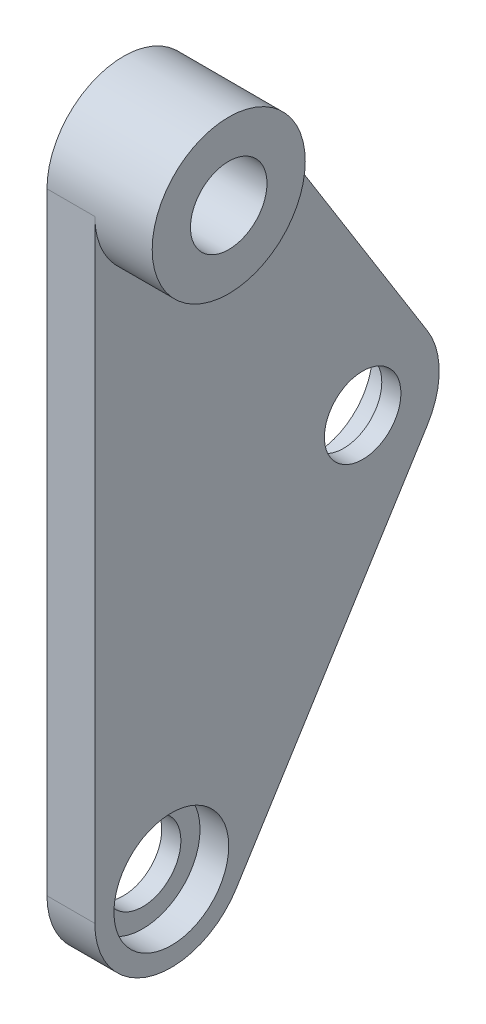
ISO-10303-21;
HEADER;
FILE_DESCRIPTION(('STEP AP214'),'2;1');
FILE_NAME('part.step','',(''),(''),'','','');
FILE_SCHEMA(('AUTOMOTIVE_DESIGN { 1 0 10303 214 1 1 1 1 }'));
ENDSEC;
DATA;
#1=APPLICATION_CONTEXT('core data for automotive mechanical design processes');
#2=APPLICATION_PROTOCOL_DEFINITION('international standard','automotive_design',2000,#1);
#3=PRODUCT_CONTEXT('',#1,'mechanical');
#4=PRODUCT('Part','Part','',(#3));
#5=PRODUCT_RELATED_PRODUCT_CATEGORY('part','',(#4));
#6=PRODUCT_DEFINITION_FORMATION('','',#4);
#7=PRODUCT_DEFINITION_CONTEXT('part definition',#1,'design');
#8=PRODUCT_DEFINITION('design','',#6,#7);
#9=PRODUCT_DEFINITION_SHAPE('','',#8);
#10=(LENGTH_UNIT() NAMED_UNIT(*) SI_UNIT(.MILLI.,.METRE.));
#11=(NAMED_UNIT(*) PLANE_ANGLE_UNIT() SI_UNIT($,.RADIAN.));
#12=(NAMED_UNIT(*) SI_UNIT($,.STERADIAN.) SOLID_ANGLE_UNIT());
#13=UNCERTAINTY_MEASURE_WITH_UNIT(LENGTH_MEASURE(1.E-05),#10,'distance_accuracy_value','');
#14=(GEOMETRIC_REPRESENTATION_CONTEXT(3) GLOBAL_UNCERTAINTY_ASSIGNED_CONTEXT((#13)) GLOBAL_UNIT_ASSIGNED_CONTEXT((#10,
#11,#12)) REPRESENTATION_CONTEXT('',''));
#15=CARTESIAN_POINT('',(0.,0.,0.));
#16=DIRECTION('',(0.,0.,1.));
#17=DIRECTION('',(1.,0.,0.));
#18=AXIS2_PLACEMENT_3D('',#15,#16,#17);
#19=CARTESIAN_POINT('',(-22.5,-4.,-4.));
#20=DIRECTION('',(1.,0.,0.));
#21=DIRECTION('',(0.,0.,1.));
#22=AXIS2_PLACEMENT_3D('',#19,#20,#21);
#23=CYLINDRICAL_SURFACE('',#22,2.);
#24=CARTESIAN_POINT('',(-17.,-4.,-4.));
#25=DIRECTION('',(1.,0.,0.));
#26=DIRECTION('',(0.,0.,-1.));
#27=AXIS2_PLACEMENT_3D('',#24,#25,#26);
#28=CIRCLE('',#27,2.);
#29=CARTESIAN_POINT('',(-17.,-4.,-6.));
#30=VERTEX_POINT('',#29);
#31=EDGE_CURVE('E209',#30,#30,#28,.T.);
#32=ORIENTED_EDGE('',*,*,#31,.T.);
#33=EDGE_LOOP('',(#32));
#34=FACE_BOUND('',#33,.T.);
#35=CARTESIAN_POINT('',(-21.,-4.,-4.));
#36=DIRECTION('',(1.,0.,0.));
#37=DIRECTION('',(0.,0.,-1.));
#38=AXIS2_PLACEMENT_3D('',#35,#36,#37);
#39=CIRCLE('',#38,2.);
#40=CARTESIAN_POINT('',(-21.,-4.,-6.));
#41=VERTEX_POINT('',#40);
#42=EDGE_CURVE('E212',#41,#41,#39,.F.);
#43=ORIENTED_EDGE('',*,*,#42,.T.);
#44=EDGE_LOOP('',(#43));
#45=FACE_BOUND('',#44,.T.);
#46=ADVANCED_FACE('F99',(#34,#45),#23,.F.);
#47=CARTESIAN_POINT('',(-22.5,-20.,-14.));
#48=DIRECTION('',(1.,0.,0.));
#49=DIRECTION('',(0.,0.,1.));
#50=AXIS2_PLACEMENT_3D('',#47,#48,#49);
#51=CYLINDRICAL_SURFACE('',#50,2.);
#52=CARTESIAN_POINT('',(-20.,-20.,-14.));
#53=DIRECTION('',(1.,0.,0.));
#54=DIRECTION('',(0.,0.,-1.));
#55=AXIS2_PLACEMENT_3D('',#52,#53,#54);
#56=CIRCLE('',#55,2.);
#57=CARTESIAN_POINT('',(-20.,-20.,-16.));
#58=VERTEX_POINT('',#57);
#59=EDGE_CURVE('E230',#58,#58,#56,.F.);
#60=ORIENTED_EDGE('',*,*,#59,.F.);
#61=EDGE_LOOP('',(#60));
#62=FACE_BOUND('',#61,.T.);
#63=CARTESIAN_POINT('',(-21.,-20.,-14.));
#64=DIRECTION('',(1.,0.,0.));
#65=DIRECTION('',(0.,0.,-1.));
#66=AXIS2_PLACEMENT_3D('',#63,#64,#65);
#67=CIRCLE('',#66,2.);
#68=CARTESIAN_POINT('',(-21.,-20.,-16.));
#69=VERTEX_POINT('',#68);
#70=EDGE_CURVE('E202',#69,#69,#67,.T.);
#71=ORIENTED_EDGE('',*,*,#70,.F.);
#72=EDGE_LOOP('',(#71));
#73=FACE_BOUND('',#72,.T.);
#74=ADVANCED_FACE('F253',(#62,#73),#51,.F.);
#75=CARTESIAN_POINT('',(-22.5,2.79415306338351,-4.47064490141361));
#76=DIRECTION('',(0.,0.52999894000318,-0.847998304005088));
#77=DIRECTION('',(0.,0.847998304005088,0.52999894000318));
#78=AXIS2_PLACEMENT_3D('',#75,#76,#77);
#79=PLANE('',#78);
#80=DIRECTION('',(0.,-0.847998304005088,-0.52999894000318));
#81=VECTOR('',#80,1.);
#82=CARTESIAN_POINT('',(-20.,2.79415306338351,-4.47064490141361));
#83=LINE('',#82,#81);
#84=CARTESIAN_POINT('',(-20.,-1.88000423998728,-7.39199321602035));
#85=VERTEX_POINT('',#84);
#86=CARTESIAN_POINT('',(-20.,-17.8800042399873,-17.3919932160204));
#87=VERTEX_POINT('',#86);
#88=EDGE_CURVE('E183',#85,#87,#83,.T.);
#89=ORIENTED_EDGE('',*,*,#88,.T.);
#90=DIRECTION('',(1.,0.,0.));
#91=VECTOR('',#90,1.);
#92=CARTESIAN_POINT('',(-22.5,-17.8800042399873,-17.3919932160204));
#93=LINE('',#92,#91);
#94=CARTESIAN_POINT('',(-22.5,-17.8800042399873,-17.3919932160204));
#95=VERTEX_POINT('',#94);
#96=EDGE_CURVE('E109',#95,#87,#93,.T.);
#97=ORIENTED_EDGE('',*,*,#96,.F.);
#98=DIRECTION('',(0.,-0.847998304005088,-0.52999894000318));
#99=VECTOR('',#98,1.);
#100=CARTESIAN_POINT('',(-22.5,2.79415306338351,-4.47064490141361));
#101=LINE('',#100,#99);
#102=CARTESIAN_POINT('',(-22.5,-1.88000423998728,-7.39199321602035));
#103=VERTEX_POINT('',#102);
#104=EDGE_CURVE('E176',#103,#95,#101,.T.);
#105=ORIENTED_EDGE('',*,*,#104,.F.);
#106=DIRECTION('',(1.,0.,0.));
#107=VECTOR('',#106,1.);
#108=CARTESIAN_POINT('',(-22.5,-1.88000423998728,-7.39199321602035));
#109=LINE('',#108,#107);
#110=EDGE_CURVE('E194',#103,#85,#109,.T.);
#111=ORIENTED_EDGE('',*,*,#110,.T.);
#112=EDGE_LOOP('',(#89,#97,#105,#111));
#113=FACE_BOUND('',#112,.T.);
#114=ADVANCED_FACE('F259',(#113),#79,.T.);
#115=CARTESIAN_POINT('',(-22.5,0.,0.));
#116=DIRECTION('',(0.,0.,-1.));
#117=DIRECTION('',(1.,0.,0.));
#118=AXIS2_PLACEMENT_3D('',#115,#116,#117);
#119=PLANE('',#118);
#120=DIRECTION('',(0.,-1.,0.));
#121=VECTOR('',#120,1.);
#122=CARTESIAN_POINT('',(-20.,0.,0.));
#123=LINE('',#122,#121);
#124=CARTESIAN_POINT('',(-20.,-4.,0.));
#125=VERTEX_POINT('',#124);
#126=CARTESIAN_POINT('',(-20.,-36.,0.));
#127=VERTEX_POINT('',#126);
#128=EDGE_CURVE('E186',#125,#127,#123,.T.);
#129=ORIENTED_EDGE('',*,*,#128,.F.);
#130=DIRECTION('',(1.,0.,0.));
#131=VECTOR('',#130,1.);
#132=CARTESIAN_POINT('',(-22.5,-4.,0.));
#133=LINE('',#132,#131);
#134=CARTESIAN_POINT('',(-22.5,-4.,0.));
#135=VERTEX_POINT('',#134);
#136=EDGE_CURVE('E171',#135,#125,#133,.T.);
#137=ORIENTED_EDGE('',*,*,#136,.F.);
#138=DIRECTION('',(0.,-1.,0.));
#139=VECTOR('',#138,1.);
#140=CARTESIAN_POINT('',(-22.5,0.,0.));
#141=LINE('',#140,#139);
#142=CARTESIAN_POINT('',(-22.5,-36.,0.));
#143=VERTEX_POINT('',#142);
#144=EDGE_CURVE('E160',#135,#143,#141,.T.);
#145=ORIENTED_EDGE('',*,*,#144,.T.);
#146=DIRECTION('',(1.,0.,0.));
#147=VECTOR('',#146,1.);
#148=CARTESIAN_POINT('',(-22.5,-36.,0.));
#149=LINE('',#148,#147);
#150=EDGE_CURVE('E168',#143,#127,#149,.T.);
#151=ORIENTED_EDGE('',*,*,#150,.T.);
#152=EDGE_LOOP('',(#129,#137,#145,#151));
#153=FACE_BOUND('',#152,.T.);
#154=ADVANCED_FACE('F174',(#153),#119,.F.);
#155=CARTESIAN_POINT('',(-22.5,-14.0301081195633,-22.4481729913013));
#156=DIRECTION('',(0.,-0.52999894000318,-0.847998304005088));
#157=DIRECTION('',(0.,0.847998304005088,-0.52999894000318));
#158=AXIS2_PLACEMENT_3D('',#155,#156,#157);
#159=PLANE('',#158);
#160=DIRECTION('',(0.,-0.847998304005088,0.52999894000318));
#161=VECTOR('',#160,1.);
#162=CARTESIAN_POINT('',(-20.,-14.0301081195633,-22.4481729913013));
#163=LINE('',#162,#161);
#164=CARTESIAN_POINT('',(-20.,-22.1199957600127,-17.3919932160204));
#165=VERTEX_POINT('',#164);
#166=CARTESIAN_POINT('',(-20.,-38.1199957600127,-7.39199321602035));
#167=VERTEX_POINT('',#166);
#168=EDGE_CURVE('E180',#165,#167,#163,.T.);
#169=ORIENTED_EDGE('',*,*,#168,.T.);
#170=DIRECTION('',(1.,0.,0.));
#171=VECTOR('',#170,1.);
#172=CARTESIAN_POINT('',(-22.5,-38.1199957600127,-7.39199321602035));
#173=LINE('',#172,#171);
#174=CARTESIAN_POINT('',(-22.5,-38.1199957600127,-7.39199321602035));
#175=VERTEX_POINT('',#174);
#176=EDGE_CURVE('E172',#175,#167,#173,.T.);
#177=ORIENTED_EDGE('',*,*,#176,.F.);
#178=DIRECTION('',(0.,-0.847998304005088,0.52999894000318));
#179=VECTOR('',#178,1.);
#180=CARTESIAN_POINT('',(-22.5,-14.0301081195633,-22.4481729913013));
#181=LINE('',#180,#179);
#182=CARTESIAN_POINT('',(-22.5,-22.1199957600127,-17.3919932160204));
#183=VERTEX_POINT('',#182);
#184=EDGE_CURVE('E163',#183,#175,#181,.T.);
#185=ORIENTED_EDGE('',*,*,#184,.F.);
#186=DIRECTION('',(1.,0.,0.));
#187=VECTOR('',#186,1.);
#188=CARTESIAN_POINT('',(-22.5,-22.1199957600127,-17.3919932160204));
#189=LINE('',#188,#187);
#190=EDGE_CURVE('E178',#183,#165,#189,.T.);
#191=ORIENTED_EDGE('',*,*,#190,.T.);
#192=EDGE_LOOP('',(#169,#177,#185,#191));
#193=FACE_BOUND('',#192,.T.);
#194=ADVANCED_FACE('F277',(#193),#159,.T.);
#195=CARTESIAN_POINT('',(-20.,0.,0.));
#196=DIRECTION('',(-1.,0.,0.));
#197=DIRECTION('',(0.,0.,-1.));
#198=AXIS2_PLACEMENT_3D('',#195,#196,#197);
#199=PLANE('',#198);
#200=CARTESIAN_POINT('',(-20.,-36.,-4.));
#201=DIRECTION('',(1.,0.,0.));
#202=DIRECTION('',(0.,0.,-1.));
#203=AXIS2_PLACEMENT_3D('',#200,#201,#202);
#204=CIRCLE('',#203,3.);
#205=CARTESIAN_POINT('',(-20.,-36.,-7.));
#206=VERTEX_POINT('',#205);
#207=EDGE_CURVE('E400',#206,#206,#204,.T.);
#208=ORIENTED_EDGE('',*,*,#207,.F.);
#209=EDGE_LOOP('',(#208));
#210=FACE_BOUND('',#209,.T.);
#211=ORIENTED_EDGE('',*,*,#59,.T.);
#212=EDGE_LOOP('',(#211));
#213=FACE_BOUND('',#212,.T.);
#214=ORIENTED_EDGE('',*,*,#128,.T.);
#215=CARTESIAN_POINT('',(-20.,-36.,-4.));
#216=DIRECTION('',(1.,0.,0.));
#217=DIRECTION('',(0.,0.,-1.));
#218=AXIS2_PLACEMENT_3D('',#215,#216,#217);
#219=CIRCLE('',#218,4.);
#220=EDGE_CURVE('E138',#127,#167,#219,.T.);
#221=ORIENTED_EDGE('',*,*,#220,.T.);
#222=ORIENTED_EDGE('',*,*,#168,.F.);
#223=CARTESIAN_POINT('',(-20.,-20.,-14.));
#224=DIRECTION('',(1.,0.,0.));
#225=DIRECTION('',(0.,0.,-1.));
#226=AXIS2_PLACEMENT_3D('',#223,#224,#225);
#227=CIRCLE('',#226,4.);
#228=EDGE_CURVE('E144',#165,#87,#227,.T.);
#229=ORIENTED_EDGE('',*,*,#228,.T.);
#230=ORIENTED_EDGE('',*,*,#88,.F.);
#231=CARTESIAN_POINT('',(-20.,-4.,-4.));
#232=DIRECTION('',(1.,0.,0.));
#233=DIRECTION('',(0.,0.,-1.));
#234=AXIS2_PLACEMENT_3D('',#231,#232,#233);
#235=CIRCLE('',#234,4.);
#236=EDGE_CURVE('E12',#125,#85,#235,.T.);
#237=ORIENTED_EDGE('',*,*,#236,.F.);
#238=EDGE_LOOP('',(#214,#221,#222,#229,#230,#237));
#239=FACE_BOUND('',#238,.T.);
#240=ADVANCED_FACE('F273',(#210,#213,#239),#199,.F.);
#241=CARTESIAN_POINT('',(-22.5,0.,0.));
#242=DIRECTION('',(-1.,0.,0.));
#243=DIRECTION('',(0.,0.,-1.));
#244=AXIS2_PLACEMENT_3D('',#241,#242,#243);
#245=PLANE('',#244);
#246=CARTESIAN_POINT('',(-22.5,-4.,-4.));
#247=DIRECTION('',(1.,0.,0.));
#248=DIRECTION('',(0.,0.,-1.));
#249=AXIS2_PLACEMENT_3D('',#246,#247,#248);
#250=CIRCLE('',#249,3.);
#251=CARTESIAN_POINT('',(-22.5,-4.,-7.));
#252=VERTEX_POINT('',#251);
#253=EDGE_CURVE('E217',#252,#252,#250,.T.);
#254=ORIENTED_EDGE('',*,*,#253,.T.);
#255=EDGE_LOOP('',(#254));
#256=FACE_BOUND('',#255,.T.);
#257=CARTESIAN_POINT('',(-22.5,-20.,-14.));
#258=DIRECTION('',(1.,0.,0.));
#259=DIRECTION('',(0.,0.,-1.));
#260=AXIS2_PLACEMENT_3D('',#257,#258,#259);
#261=CIRCLE('',#260,3.);
#262=CARTESIAN_POINT('',(-22.5,-20.,-17.));
#263=VERTEX_POINT('',#262);
#264=EDGE_CURVE('E223',#263,#263,#261,.T.);
#265=ORIENTED_EDGE('',*,*,#264,.T.);
#266=EDGE_LOOP('',(#265));
#267=FACE_BOUND('',#266,.T.);
#268=CARTESIAN_POINT('',(-22.5,-36.,-4.));
#269=DIRECTION('',(1.,0.,0.));
#270=DIRECTION('',(0.,0.,-1.));
#271=AXIS2_PLACEMENT_3D('',#268,#269,#270);
#272=CIRCLE('',#271,2.);
#273=CARTESIAN_POINT('',(-22.5,-36.,-6.));
#274=VERTEX_POINT('',#273);
#275=EDGE_CURVE('E204',#274,#274,#272,.T.);
#276=ORIENTED_EDGE('',*,*,#275,.T.);
#277=EDGE_LOOP('',(#276));
#278=FACE_BOUND('',#277,.T.);
#279=ORIENTED_EDGE('',*,*,#184,.T.);
#280=CARTESIAN_POINT('',(-22.5,-36.,-4.));
#281=DIRECTION('',(1.,0.,0.));
#282=DIRECTION('',(0.,0.,-1.));
#283=AXIS2_PLACEMENT_3D('',#280,#281,#282);
#284=CIRCLE('',#283,4.);
#285=EDGE_CURVE('E156',#143,#175,#284,.T.);
#286=ORIENTED_EDGE('',*,*,#285,.F.);
#287=ORIENTED_EDGE('',*,*,#144,.F.);
#288=CARTESIAN_POINT('',(-22.5,-4.,-4.));
#289=DIRECTION('',(1.,0.,0.));
#290=DIRECTION('',(0.,0.,-1.));
#291=AXIS2_PLACEMENT_3D('',#288,#289,#290);
#292=CIRCLE('',#291,4.);
#293=EDGE_CURVE('E187',#103,#135,#292,.T.);
#294=ORIENTED_EDGE('',*,*,#293,.F.);
#295=ORIENTED_EDGE('',*,*,#104,.T.);
#296=CARTESIAN_POINT('',(-22.5,-20.,-14.));
#297=DIRECTION('',(1.,0.,0.));
#298=DIRECTION('',(0.,0.,-1.));
#299=AXIS2_PLACEMENT_3D('',#296,#297,#298);
#300=CIRCLE('',#299,4.);
#301=EDGE_CURVE('E118',#183,#95,#300,.T.);
#302=ORIENTED_EDGE('',*,*,#301,.F.);
#303=EDGE_LOOP('',(#279,#286,#287,#294,#295,#302));
#304=FACE_BOUND('',#303,.T.);
#305=ADVANCED_FACE('F158',(#256,#267,#278,#304),#245,.T.);
#306=CARTESIAN_POINT('',(-22.5,-36.,-4.));
#307=DIRECTION('',(1.,0.,0.));
#308=DIRECTION('',(0.,0.,1.));
#309=AXIS2_PLACEMENT_3D('',#306,#307,#308);
#310=CYLINDRICAL_SURFACE('',#309,4.);
#311=ORIENTED_EDGE('',*,*,#285,.T.);
#312=ORIENTED_EDGE('',*,*,#176,.T.);
#313=ORIENTED_EDGE('',*,*,#220,.F.);
#314=ORIENTED_EDGE('',*,*,#150,.F.);
#315=EDGE_LOOP('',(#311,#312,#313,#314));
#316=FACE_BOUND('',#315,.T.);
#317=ADVANCED_FACE('F101',(#316),#310,.T.);
#318=CARTESIAN_POINT('',(-22.5,-20.,-14.));
#319=DIRECTION('',(1.,0.,0.));
#320=DIRECTION('',(0.,0.,1.));
#321=AXIS2_PLACEMENT_3D('',#318,#319,#320);
#322=CYLINDRICAL_SURFACE('',#321,4.);
#323=ORIENTED_EDGE('',*,*,#228,.F.);
#324=ORIENTED_EDGE('',*,*,#190,.F.);
#325=ORIENTED_EDGE('',*,*,#301,.T.);
#326=ORIENTED_EDGE('',*,*,#96,.T.);
#327=EDGE_LOOP('',(#323,#324,#325,#326));
#328=FACE_BOUND('',#327,.T.);
#329=ADVANCED_FACE('F241',(#328),#322,.T.);
#330=CARTESIAN_POINT('',(-22.5,-4.,-4.));
#331=DIRECTION('',(1.,0.,0.));
#332=DIRECTION('',(0.,0.,1.));
#333=AXIS2_PLACEMENT_3D('',#330,#331,#332);
#334=CYLINDRICAL_SURFACE('',#333,4.);
#335=ORIENTED_EDGE('',*,*,#293,.T.);
#336=ORIENTED_EDGE('',*,*,#136,.T.);
#337=ORIENTED_EDGE('',*,*,#236,.T.);
#338=ORIENTED_EDGE('',*,*,#110,.F.);
#339=EDGE_LOOP('',(#335,#336,#337,#338));
#340=FACE_BOUND('',#339,.T.);
#341=CARTESIAN_POINT('',(-17.,-4.,-4.));
#342=DIRECTION('',(1.,0.,0.));
#343=DIRECTION('',(0.,0.,-1.));
#344=AXIS2_PLACEMENT_3D('',#341,#342,#343);
#345=CIRCLE('',#344,4.);
#346=CARTESIAN_POINT('',(-17.,-4.,-8.));
#347=VERTEX_POINT('',#346);
#348=EDGE_CURVE('E201',#347,#347,#345,.T.);
#349=ORIENTED_EDGE('',*,*,#348,.F.);
#350=EDGE_LOOP('',(#349));
#351=FACE_BOUND('',#350,.T.);
#352=ADVANCED_FACE('F239',(#340,#351),#334,.T.);
#353=CARTESIAN_POINT('',(-17.,-4.,-4.));
#354=DIRECTION('',(-1.,0.,0.));
#355=DIRECTION('',(0.,0.,-1.));
#356=AXIS2_PLACEMENT_3D('',#353,#354,#355);
#357=PLANE('',#356);
#358=ORIENTED_EDGE('',*,*,#31,.F.);
#359=EDGE_LOOP('',(#358));
#360=FACE_BOUND('',#359,.T.);
#361=ORIENTED_EDGE('',*,*,#348,.T.);
#362=EDGE_LOOP('',(#361));
#363=FACE_BOUND('',#362,.T.);
#364=ADVANCED_FACE('F237',(#360,#363),#357,.F.);
#365=CARTESIAN_POINT('',(-22.5,-36.,-4.));
#366=DIRECTION('',(1.,0.,0.));
#367=DIRECTION('',(0.,0.,1.));
#368=AXIS2_PLACEMENT_3D('',#365,#366,#367);
#369=CYLINDRICAL_SURFACE('',#368,2.);
#370=CARTESIAN_POINT('',(-21.5,-36.,-4.));
#371=DIRECTION('',(1.,0.,0.));
#372=DIRECTION('',(0.,0.,-1.));
#373=AXIS2_PLACEMENT_3D('',#370,#371,#372);
#374=CIRCLE('',#373,2.);
#375=CARTESIAN_POINT('',(-21.5,-36.,-6.));
#376=VERTEX_POINT('',#375);
#377=EDGE_CURVE('E103',#376,#376,#374,.T.);
#378=ORIENTED_EDGE('',*,*,#377,.T.);
#379=EDGE_LOOP('',(#378));
#380=FACE_BOUND('',#379,.T.);
#381=ORIENTED_EDGE('',*,*,#275,.F.);
#382=EDGE_LOOP('',(#381));
#383=FACE_BOUND('',#382,.T.);
#384=ADVANCED_FACE('F248',(#380,#383),#369,.F.);
#385=CARTESIAN_POINT('',(-21.,-20.,-14.));
#386=DIRECTION('',(-1.,0.,0.));
#387=DIRECTION('',(0.,0.,-1.));
#388=AXIS2_PLACEMENT_3D('',#385,#386,#387);
#389=CYLINDRICAL_SURFACE('',#388,3.);
#390=CARTESIAN_POINT('',(-21.,-20.,-14.));
#391=DIRECTION('',(1.,0.,0.));
#392=DIRECTION('',(0.,0.,-1.));
#393=AXIS2_PLACEMENT_3D('',#390,#391,#392);
#394=CIRCLE('',#393,3.);
#395=CARTESIAN_POINT('',(-21.,-20.,-17.));
#396=VERTEX_POINT('',#395);
#397=EDGE_CURVE('E226',#396,#396,#394,.T.);
#398=ORIENTED_EDGE('',*,*,#397,.T.);
#399=EDGE_LOOP('',(#398));
#400=FACE_BOUND('',#399,.T.);
#401=ORIENTED_EDGE('',*,*,#264,.F.);
#402=EDGE_LOOP('',(#401));
#403=FACE_BOUND('',#402,.T.);
#404=ADVANCED_FACE('F268',(#400,#403),#389,.F.);
#405=CARTESIAN_POINT('',(-21.,-20.,-14.));
#406=DIRECTION('',(-1.,0.,0.));
#407=DIRECTION('',(0.,0.,-1.));
#408=AXIS2_PLACEMENT_3D('',#405,#406,#407);
#409=PLANE('',#408);
#410=ORIENTED_EDGE('',*,*,#70,.T.);
#411=EDGE_LOOP('',(#410));
#412=FACE_BOUND('',#411,.T.);
#413=ORIENTED_EDGE('',*,*,#397,.F.);
#414=EDGE_LOOP('',(#413));
#415=FACE_BOUND('',#414,.T.);
#416=ADVANCED_FACE('F264',(#412,#415),#409,.T.);
#417=CARTESIAN_POINT('',(-21.,-4.,-4.));
#418=DIRECTION('',(-1.,0.,0.));
#419=DIRECTION('',(0.,0.,-1.));
#420=AXIS2_PLACEMENT_3D('',#417,#418,#419);
#421=CYLINDRICAL_SURFACE('',#420,3.);
#422=CARTESIAN_POINT('',(-21.,-4.,-4.));
#423=DIRECTION('',(1.,0.,0.));
#424=DIRECTION('',(0.,0.,-1.));
#425=AXIS2_PLACEMENT_3D('',#422,#423,#424);
#426=CIRCLE('',#425,3.);
#427=CARTESIAN_POINT('',(-21.,-4.,-7.));
#428=VERTEX_POINT('',#427);
#429=EDGE_CURVE('E205',#428,#428,#426,.T.);
#430=ORIENTED_EDGE('',*,*,#429,.T.);
#431=EDGE_LOOP('',(#430));
#432=FACE_BOUND('',#431,.T.);
#433=ORIENTED_EDGE('',*,*,#253,.F.);
#434=EDGE_LOOP('',(#433));
#435=FACE_BOUND('',#434,.T.);
#436=ADVANCED_FACE('F353',(#432,#435),#421,.F.);
#437=CARTESIAN_POINT('',(-21.,0.,0.));
#438=DIRECTION('',(-1.,0.,0.));
#439=DIRECTION('',(0.,0.,-1.));
#440=AXIS2_PLACEMENT_3D('',#437,#438,#439);
#441=PLANE('',#440);
#442=ORIENTED_EDGE('',*,*,#42,.F.);
#443=EDGE_LOOP('',(#442));
#444=FACE_BOUND('',#443,.T.);
#445=ORIENTED_EDGE('',*,*,#429,.F.);
#446=EDGE_LOOP('',(#445));
#447=FACE_BOUND('',#446,.T.);
#448=ADVANCED_FACE('F361',(#444,#447),#441,.T.);
#449=CARTESIAN_POINT('',(-21.5,-36.,-4.));
#450=DIRECTION('',(1.,0.,0.));
#451=DIRECTION('',(0.,0.,1.));
#452=AXIS2_PLACEMENT_3D('',#449,#450,#451);
#453=CYLINDRICAL_SURFACE('',#452,3.);
#454=CARTESIAN_POINT('',(-21.5,-36.,-4.));
#455=DIRECTION('',(1.,0.,0.));
#456=DIRECTION('',(0.,0.,-1.));
#457=AXIS2_PLACEMENT_3D('',#454,#455,#456);
#458=CIRCLE('',#457,3.);
#459=CARTESIAN_POINT('',(-21.5,-36.,-7.));
#460=VERTEX_POINT('',#459);
#461=EDGE_CURVE('E399',#460,#460,#458,.T.);
#462=ORIENTED_EDGE('',*,*,#461,.F.);
#463=EDGE_LOOP('',(#462));
#464=FACE_BOUND('',#463,.T.);
#465=ORIENTED_EDGE('',*,*,#207,.T.);
#466=EDGE_LOOP('',(#465));
#467=FACE_BOUND('',#466,.T.);
#468=ADVANCED_FACE('F370',(#464,#467),#453,.F.);
#469=CARTESIAN_POINT('',(-21.5,-36.,-4.));
#470=DIRECTION('',(-1.,0.,0.));
#471=DIRECTION('',(0.,0.,-1.));
#472=AXIS2_PLACEMENT_3D('',#469,#470,#471);
#473=PLANE('',#472);
#474=ORIENTED_EDGE('',*,*,#377,.F.);
#475=EDGE_LOOP('',(#474));
#476=FACE_BOUND('',#475,.T.);
#477=ORIENTED_EDGE('',*,*,#461,.T.);
#478=EDGE_LOOP('',(#477));
#479=FACE_BOUND('',#478,.T.);
#480=ADVANCED_FACE('F380',(#476,#479),#473,.F.);
#481=CLOSED_SHELL('',(#46,#74,#114,#154,#194,#240,#305,#317,#329,#352,#364,#384,#404,#416,#436,
#448,#468,#480));
#482=MANIFOLD_SOLID_BREP('B2',#481);
#483=ADVANCED_BREP_SHAPE_REPRESENTATION('',(#18,#482),#14);
#484=SHAPE_DEFINITION_REPRESENTATION(#9,#483);
ENDSEC;
END-ISO-10303-21;
